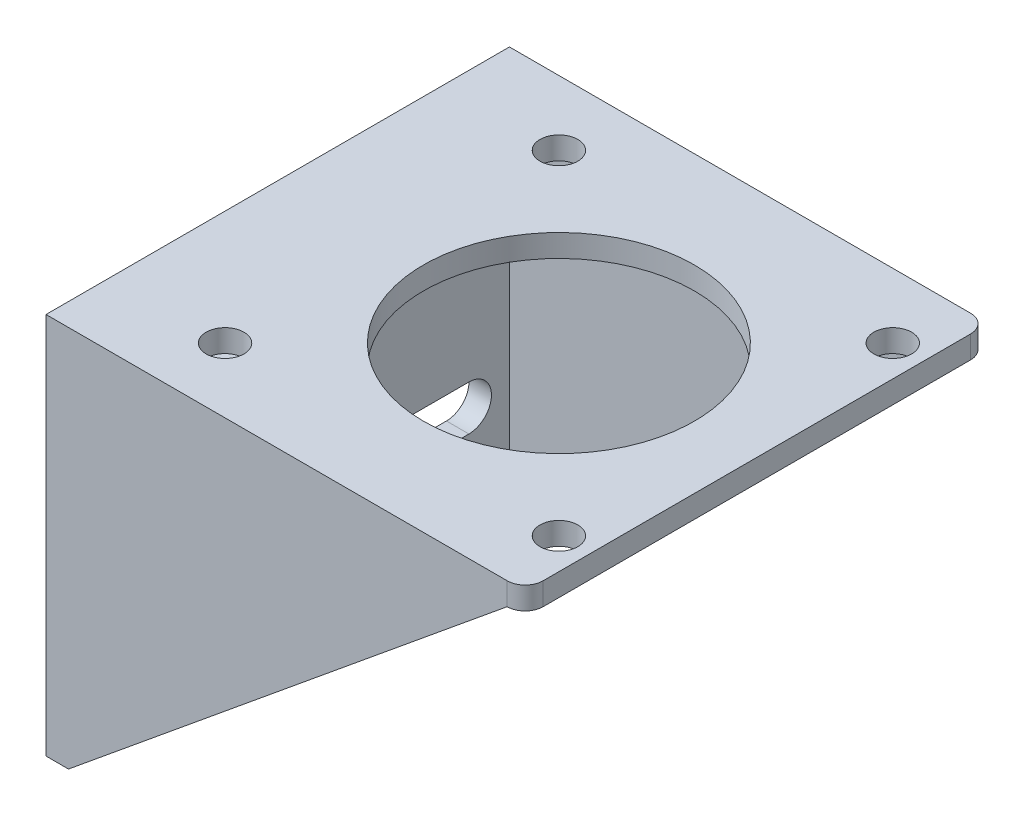
ISO-10303-21;
HEADER;
FILE_DESCRIPTION(('STEP AP214'),'2;1');
FILE_NAME('part.step','',(''),(''),'','','');
FILE_SCHEMA(('AUTOMOTIVE_DESIGN { 1 0 10303 214 1 1 1 1 }'));
ENDSEC;
DATA;
#1=APPLICATION_CONTEXT('core data for automotive mechanical design processes');
#2=APPLICATION_PROTOCOL_DEFINITION('international standard','automotive_design',2000,#1);
#3=PRODUCT_CONTEXT('',#1,'mechanical');
#4=PRODUCT('Part','Part','',(#3));
#5=PRODUCT_RELATED_PRODUCT_CATEGORY('part','',(#4));
#6=PRODUCT_DEFINITION_FORMATION('','',#4);
#7=PRODUCT_DEFINITION_CONTEXT('part definition',#1,'design');
#8=PRODUCT_DEFINITION('design','',#6,#7);
#9=PRODUCT_DEFINITION_SHAPE('','',#8);
#10=(LENGTH_UNIT() NAMED_UNIT(*) SI_UNIT(.MILLI.,.METRE.));
#11=(NAMED_UNIT(*) PLANE_ANGLE_UNIT() SI_UNIT($,.RADIAN.));
#12=(NAMED_UNIT(*) SI_UNIT($,.STERADIAN.) SOLID_ANGLE_UNIT());
#13=UNCERTAINTY_MEASURE_WITH_UNIT(LENGTH_MEASURE(1.E-05),#10,'distance_accuracy_value','');
#14=(GEOMETRIC_REPRESENTATION_CONTEXT(3) GLOBAL_UNCERTAINTY_ASSIGNED_CONTEXT((#13)) GLOBAL_UNIT_ASSIGNED_CONTEXT((#10,
#11,#12)) REPRESENTATION_CONTEXT('',''));
#15=CARTESIAN_POINT('',(0.,0.,0.));
#16=DIRECTION('',(0.,0.,1.));
#17=DIRECTION('',(1.,0.,0.));
#18=AXIS2_PLACEMENT_3D('',#15,#16,#17);
#19=CARTESIAN_POINT('',(-36.5125,0.,0.));
#20=DIRECTION('',(-1.,0.,0.));
#21=DIRECTION('',(0.,0.,1.));
#22=AXIS2_PLACEMENT_3D('',#19,#20,#21);
#23=PLANE('',#22);
#24=DIRECTION('',(0.,0.,1.));
#25=VECTOR('',#24,1.);
#26=CARTESIAN_POINT('',(-36.5125,-31.75,0.));
#27=LINE('',#26,#25);
#28=CARTESIAN_POINT('',(-36.5125,-31.75,2.2225));
#29=VERTEX_POINT('',#28);
#30=CARTESIAN_POINT('',(-36.5125,-31.75,12.3825));
#31=VERTEX_POINT('',#30);
#32=EDGE_CURVE('E300',#29,#31,#27,.T.);
#33=ORIENTED_EDGE('',*,*,#32,.F.);
#34=CARTESIAN_POINT('',(-36.5125,-34.925,2.2225));
#35=DIRECTION('',(1.,0.,0.));
#36=DIRECTION('',(0.,0.,-1.));
#37=AXIS2_PLACEMENT_3D('',#34,#35,#36);
#38=CIRCLE('',#37,3.175);
#39=CARTESIAN_POINT('',(-36.5125,-38.1,2.2225));
#40=VERTEX_POINT('',#39);
#41=EDGE_CURVE('E54',#40,#29,#38,.T.);
#42=ORIENTED_EDGE('',*,*,#41,.F.);
#43=DIRECTION('',(0.,0.,1.));
#44=VECTOR('',#43,1.);
#45=CARTESIAN_POINT('',(-36.5125,-38.1,0.));
#46=LINE('',#45,#44);
#47=CARTESIAN_POINT('',(-36.5125,-38.1,12.3825));
#48=VERTEX_POINT('',#47);
#49=EDGE_CURVE('E290',#40,#48,#46,.T.);
#50=ORIENTED_EDGE('',*,*,#49,.T.);
#51=CARTESIAN_POINT('',(-36.5125,-34.925,12.3825));
#52=DIRECTION('',(1.,0.,0.));
#53=DIRECTION('',(0.,0.,-1.));
#54=AXIS2_PLACEMENT_3D('',#51,#52,#53);
#55=CIRCLE('',#54,3.175);
#56=EDGE_CURVE('E303',#31,#48,#55,.T.);
#57=ORIENTED_EDGE('',*,*,#56,.F.);
#58=EDGE_LOOP('',(#33,#42,#50,#57));
#59=FACE_BOUND('',#58,.T.);
#60=DIRECTION('',(0.,0.,1.));
#61=VECTOR('',#60,1.);
#62=CARTESIAN_POINT('',(-36.5125,-31.75,0.));
#63=LINE('',#62,#61);
#64=CARTESIAN_POINT('',(-36.5125,-31.75,-23.8125));
#65=VERTEX_POINT('',#64);
#66=CARTESIAN_POINT('',(-36.5125,-31.75,-13.6525));
#67=VERTEX_POINT('',#66);
#68=EDGE_CURVE('E271',#65,#67,#63,.T.);
#69=ORIENTED_EDGE('',*,*,#68,.F.);
#70=CARTESIAN_POINT('',(-36.5125,-34.925,-23.8125));
#71=DIRECTION('',(1.,0.,0.));
#72=DIRECTION('',(0.,0.,-1.));
#73=AXIS2_PLACEMENT_3D('',#70,#71,#72);
#74=CIRCLE('',#73,3.175);
#75=CARTESIAN_POINT('',(-36.5125,-38.1,-23.8125));
#76=VERTEX_POINT('',#75);
#77=EDGE_CURVE('E62',#76,#65,#74,.T.);
#78=ORIENTED_EDGE('',*,*,#77,.F.);
#79=DIRECTION('',(0.,0.,1.));
#80=VECTOR('',#79,1.);
#81=CARTESIAN_POINT('',(-36.5125,-38.1,0.));
#82=LINE('',#81,#80);
#83=CARTESIAN_POINT('',(-36.5125,-38.1,-13.6525));
#84=VERTEX_POINT('',#83);
#85=EDGE_CURVE('E261',#76,#84,#82,.T.);
#86=ORIENTED_EDGE('',*,*,#85,.T.);
#87=CARTESIAN_POINT('',(-36.5125,-34.925,-13.6525));
#88=DIRECTION('',(1.,0.,0.));
#89=DIRECTION('',(0.,0.,-1.));
#90=AXIS2_PLACEMENT_3D('',#87,#88,#89);
#91=CIRCLE('',#90,3.175);
#92=EDGE_CURVE('E275',#67,#84,#91,.T.);
#93=ORIENTED_EDGE('',*,*,#92,.F.);
#94=EDGE_LOOP('',(#69,#78,#86,#93));
#95=FACE_BOUND('',#94,.T.);
#96=CARTESIAN_POINT('',(-36.5125,-9.525,-13.6525));
#97=DIRECTION('',(1.,0.,0.));
#98=DIRECTION('',(0.,0.,-1.));
#99=AXIS2_PLACEMENT_3D('',#96,#97,#98);
#100=CIRCLE('',#99,3.175);
#101=CARTESIAN_POINT('',(-36.5125,-6.35,-13.6525));
#102=VERTEX_POINT('',#101);
#103=CARTESIAN_POINT('',(-36.5125,-12.7,-13.6525));
#104=VERTEX_POINT('',#103);
#105=EDGE_CURVE('E246',#102,#104,#100,.T.);
#106=ORIENTED_EDGE('',*,*,#105,.F.);
#107=DIRECTION('',(0.,0.,1.));
#108=VECTOR('',#107,1.);
#109=CARTESIAN_POINT('',(-36.5125,-6.35,0.));
#110=LINE('',#109,#108);
#111=CARTESIAN_POINT('',(-36.5125,-6.35,-23.8125));
#112=VERTEX_POINT('',#111);
#113=EDGE_CURVE('E219',#112,#102,#110,.T.);
#114=ORIENTED_EDGE('',*,*,#113,.F.);
#115=CARTESIAN_POINT('',(-36.5125,-9.525,-23.8125));
#116=DIRECTION('',(1.,0.,0.));
#117=DIRECTION('',(0.,0.,-1.));
#118=AXIS2_PLACEMENT_3D('',#115,#116,#117);
#119=CIRCLE('',#118,3.175);
#120=CARTESIAN_POINT('',(-36.5125,-12.7,-23.8125));
#121=VERTEX_POINT('',#120);
#122=EDGE_CURVE('E237',#121,#112,#119,.T.);
#123=ORIENTED_EDGE('',*,*,#122,.F.);
#124=DIRECTION('',(0.,0.,1.));
#125=VECTOR('',#124,1.);
#126=CARTESIAN_POINT('',(-36.5125,-12.7,0.));
#127=LINE('',#126,#125);
#128=EDGE_CURVE('E240',#121,#104,#127,.T.);
#129=ORIENTED_EDGE('',*,*,#128,.T.);
#130=EDGE_LOOP('',(#106,#114,#123,#129));
#131=FACE_BOUND('',#130,.T.);
#132=DIRECTION('',(0.,1.,0.));
#133=VECTOR('',#132,1.);
#134=CARTESIAN_POINT('',(-36.5125,0.,-29.5275));
#135=LINE('',#134,#133);
#136=CARTESIAN_POINT('',(-36.5125,-50.8,-29.5275));
#137=VERTEX_POINT('',#136);
#138=CARTESIAN_POINT('',(-36.5125,0.,-29.5275));
#139=VERTEX_POINT('',#138);
#140=EDGE_CURVE('E349',#137,#139,#135,.T.);
#141=ORIENTED_EDGE('',*,*,#140,.T.);
#142=DIRECTION('',(0.,0.,-1.));
#143=VECTOR('',#142,1.);
#144=CARTESIAN_POINT('',(-36.5125,0.,-32.7025));
#145=LINE('',#144,#143);
#146=CARTESIAN_POINT('',(-36.5125,0.,29.5275));
#147=VERTEX_POINT('',#146);
#148=EDGE_CURVE('E376',#147,#139,#145,.T.);
#149=ORIENTED_EDGE('',*,*,#148,.F.);
#150=DIRECTION('',(0.,-1.,0.));
#151=VECTOR('',#150,1.);
#152=CARTESIAN_POINT('',(-36.5125,0.,29.5275));
#153=LINE('',#152,#151);
#154=CARTESIAN_POINT('',(-36.5125,-50.8,29.5275));
#155=VERTEX_POINT('',#154);
#156=EDGE_CURVE('E360',#147,#155,#153,.T.);
#157=ORIENTED_EDGE('',*,*,#156,.T.);
#158=DIRECTION('',(0.,0.,1.));
#159=VECTOR('',#158,1.);
#160=CARTESIAN_POINT('',(-36.5125,-50.8,32.7025));
#161=LINE('',#160,#159);
#162=EDGE_CURVE('E379',#137,#155,#161,.T.);
#163=ORIENTED_EDGE('',*,*,#162,.F.);
#164=EDGE_LOOP('',(#141,#149,#157,#163));
#165=FACE_BOUND('',#164,.T.);
#166=DIRECTION('',(0.,0.,1.));
#167=VECTOR('',#166,1.);
#168=CARTESIAN_POINT('',(-36.5125,-12.7,0.));
#169=LINE('',#168,#167);
#170=CARTESIAN_POINT('',(-36.5125,-12.7,2.2225));
#171=VERTEX_POINT('',#170);
#172=CARTESIAN_POINT('',(-36.5125,-12.7,12.3825));
#173=VERTEX_POINT('',#172);
#174=EDGE_CURVE('E253',#171,#173,#169,.T.);
#175=ORIENTED_EDGE('',*,*,#174,.T.);
#176=CARTESIAN_POINT('',(-36.5125,-9.525,12.3825));
#177=DIRECTION('',(1.,0.,0.));
#178=DIRECTION('',(0.,0.,-1.));
#179=AXIS2_PLACEMENT_3D('',#176,#177,#178);
#180=CIRCLE('',#179,3.175);
#181=CARTESIAN_POINT('',(-36.5125,-6.35,12.3825));
#182=VERTEX_POINT('',#181);
#183=EDGE_CURVE('E317',#182,#173,#180,.T.);
#184=ORIENTED_EDGE('',*,*,#183,.F.);
#185=DIRECTION('',(0.,0.,1.));
#186=VECTOR('',#185,1.);
#187=CARTESIAN_POINT('',(-36.5125,-6.35,0.));
#188=LINE('',#187,#186);
#189=CARTESIAN_POINT('',(-36.5125,-6.35,2.2225));
#190=VERTEX_POINT('',#189);
#191=EDGE_CURVE('E332',#190,#182,#188,.T.);
#192=ORIENTED_EDGE('',*,*,#191,.F.);
#193=CARTESIAN_POINT('',(-36.5125,-9.525,2.2225));
#194=DIRECTION('',(1.,0.,0.));
#195=DIRECTION('',(0.,0.,-1.));
#196=AXIS2_PLACEMENT_3D('',#193,#194,#195);
#197=CIRCLE('',#196,3.175);
#198=EDGE_CURVE('E329',#171,#190,#197,.T.);
#199=ORIENTED_EDGE('',*,*,#198,.F.);
#200=EDGE_LOOP('',(#175,#184,#192,#199));
#201=FACE_BOUND('',#200,.T.);
#202=ADVANCED_FACE('F39',(#59,#95,#131,#165,#201),#23,.F.);
#203=CARTESIAN_POINT('',(-39.6875,3.175,32.7025));
#204=DIRECTION('',(1.,0.,0.));
#205=DIRECTION('',(0.,0.,-1.));
#206=AXIS2_PLACEMENT_3D('',#203,#204,#205);
#207=PLANE('',#206);
#208=DIRECTION('',(0.,0.,1.));
#209=VECTOR('',#208,1.);
#210=CARTESIAN_POINT('',(-39.6875,-38.1,0.));
#211=LINE('',#210,#209);
#212=CARTESIAN_POINT('',(-39.6875,-38.1,2.2225));
#213=VERTEX_POINT('',#212);
#214=CARTESIAN_POINT('',(-39.6875,-38.1,12.3825));
#215=VERTEX_POINT('',#214);
#216=EDGE_CURVE('E296',#213,#215,#211,.T.);
#217=ORIENTED_EDGE('',*,*,#216,.F.);
#218=CARTESIAN_POINT('',(-39.6875,-34.925,2.2225));
#219=DIRECTION('',(1.,0.,0.));
#220=DIRECTION('',(0.,0.,-1.));
#221=AXIS2_PLACEMENT_3D('',#218,#219,#220);
#222=CIRCLE('',#221,3.175);
#223=CARTESIAN_POINT('',(-39.6875,-31.75,2.2225));
#224=VERTEX_POINT('',#223);
#225=EDGE_CURVE('E286',#213,#224,#222,.T.);
#226=ORIENTED_EDGE('',*,*,#225,.T.);
#227=DIRECTION('',(0.,0.,1.));
#228=VECTOR('',#227,1.);
#229=CARTESIAN_POINT('',(-39.6875,-31.75,0.));
#230=LINE('',#229,#228);
#231=CARTESIAN_POINT('',(-39.6875,-31.75,12.3825));
#232=VERTEX_POINT('',#231);
#233=EDGE_CURVE('E289',#224,#232,#230,.T.);
#234=ORIENTED_EDGE('',*,*,#233,.T.);
#235=CARTESIAN_POINT('',(-39.6875,-34.925,12.3825));
#236=DIRECTION('',(1.,0.,0.));
#237=DIRECTION('',(0.,0.,-1.));
#238=AXIS2_PLACEMENT_3D('',#235,#236,#237);
#239=CIRCLE('',#238,3.175);
#240=EDGE_CURVE('E293',#232,#215,#239,.T.);
#241=ORIENTED_EDGE('',*,*,#240,.T.);
#242=EDGE_LOOP('',(#217,#226,#234,#241));
#243=FACE_BOUND('',#242,.T.);
#244=DIRECTION('',(0.,0.,1.));
#245=VECTOR('',#244,1.);
#246=CARTESIAN_POINT('',(-39.6875,-38.1,0.));
#247=LINE('',#246,#245);
#248=CARTESIAN_POINT('',(-39.6875,-38.1,-23.8125));
#249=VERTEX_POINT('',#248);
#250=CARTESIAN_POINT('',(-39.6875,-38.1,-13.6525));
#251=VERTEX_POINT('',#250);
#252=EDGE_CURVE('E267',#249,#251,#247,.T.);
#253=ORIENTED_EDGE('',*,*,#252,.F.);
#254=CARTESIAN_POINT('',(-39.6875,-34.925,-23.8125));
#255=DIRECTION('',(1.,0.,0.));
#256=DIRECTION('',(0.,0.,-1.));
#257=AXIS2_PLACEMENT_3D('',#254,#255,#256);
#258=CIRCLE('',#257,3.175);
#259=CARTESIAN_POINT('',(-39.6875,-31.75,-23.8125));
#260=VERTEX_POINT('',#259);
#261=EDGE_CURVE('E257',#249,#260,#258,.T.);
#262=ORIENTED_EDGE('',*,*,#261,.T.);
#263=DIRECTION('',(0.,0.,1.));
#264=VECTOR('',#263,1.);
#265=CARTESIAN_POINT('',(-39.6875,-31.75,0.));
#266=LINE('',#265,#264);
#267=CARTESIAN_POINT('',(-39.6875,-31.75,-13.6525));
#268=VERTEX_POINT('',#267);
#269=EDGE_CURVE('E260',#260,#268,#266,.T.);
#270=ORIENTED_EDGE('',*,*,#269,.T.);
#271=CARTESIAN_POINT('',(-39.6875,-34.925,-13.6525));
#272=DIRECTION('',(1.,0.,0.));
#273=DIRECTION('',(0.,0.,-1.));
#274=AXIS2_PLACEMENT_3D('',#271,#272,#273);
#275=CIRCLE('',#274,3.175);
#276=EDGE_CURVE('E264',#268,#251,#275,.T.);
#277=ORIENTED_EDGE('',*,*,#276,.T.);
#278=EDGE_LOOP('',(#253,#262,#270,#277));
#279=FACE_BOUND('',#278,.T.);
#280=CARTESIAN_POINT('',(-39.6875,-9.525,-23.8125));
#281=DIRECTION('',(1.,0.,0.));
#282=DIRECTION('',(0.,0.,-1.));
#283=AXIS2_PLACEMENT_3D('',#280,#281,#282);
#284=CIRCLE('',#283,3.175);
#285=CARTESIAN_POINT('',(-39.6875,-12.7,-23.8125));
#286=VERTEX_POINT('',#285);
#287=CARTESIAN_POINT('',(-39.6875,-6.35,-23.8125));
#288=VERTEX_POINT('',#287);
#289=EDGE_CURVE('E224',#286,#288,#284,.T.);
#290=ORIENTED_EDGE('',*,*,#289,.T.);
#291=DIRECTION('',(0.,0.,1.));
#292=VECTOR('',#291,1.);
#293=CARTESIAN_POINT('',(-39.6875,-6.35,0.));
#294=LINE('',#293,#292);
#295=CARTESIAN_POINT('',(-39.6875,-6.35,-13.6525));
#296=VERTEX_POINT('',#295);
#297=EDGE_CURVE('E216',#288,#296,#294,.T.);
#298=ORIENTED_EDGE('',*,*,#297,.T.);
#299=CARTESIAN_POINT('',(-39.6875,-9.525,-13.6525));
#300=DIRECTION('',(1.,0.,0.));
#301=DIRECTION('',(0.,0.,-1.));
#302=AXIS2_PLACEMENT_3D('',#299,#300,#301);
#303=CIRCLE('',#302,3.175);
#304=CARTESIAN_POINT('',(-39.6875,-12.7,-13.6525));
#305=VERTEX_POINT('',#304);
#306=EDGE_CURVE('E227',#296,#305,#303,.T.);
#307=ORIENTED_EDGE('',*,*,#306,.T.);
#308=DIRECTION('',(0.,0.,1.));
#309=VECTOR('',#308,1.);
#310=CARTESIAN_POINT('',(-39.6875,-12.7,0.));
#311=LINE('',#310,#309);
#312=EDGE_CURVE('E232',#286,#305,#311,.T.);
#313=ORIENTED_EDGE('',*,*,#312,.F.);
#314=EDGE_LOOP('',(#290,#298,#307,#313));
#315=FACE_BOUND('',#314,.T.);
#316=DIRECTION('',(0.,-1.,0.));
#317=VECTOR('',#316,1.);
#318=CARTESIAN_POINT('',(-39.6875,3.175,-32.7025));
#319=LINE('',#318,#317);
#320=CARTESIAN_POINT('',(-39.6875,3.175,-32.7025));
#321=VERTEX_POINT('',#320);
#322=CARTESIAN_POINT('',(-39.6875,-50.8,-32.7025));
#323=VERTEX_POINT('',#322);
#324=EDGE_CURVE('E433',#321,#323,#319,.T.);
#325=ORIENTED_EDGE('',*,*,#324,.T.);
#326=DIRECTION('',(0.,0.,1.));
#327=VECTOR('',#326,1.);
#328=CARTESIAN_POINT('',(-39.6875,-50.8,32.7025));
#329=LINE('',#328,#327);
#330=CARTESIAN_POINT('',(-39.6875,-50.8,32.7025));
#331=VERTEX_POINT('',#330);
#332=EDGE_CURVE('E373',#323,#331,#329,.T.);
#333=ORIENTED_EDGE('',*,*,#332,.T.);
#334=DIRECTION('',(0.,-1.,0.));
#335=VECTOR('',#334,1.);
#336=CARTESIAN_POINT('',(-39.6875,3.175,32.7025));
#337=LINE('',#336,#335);
#338=CARTESIAN_POINT('',(-39.6875,3.175,32.7025));
#339=VERTEX_POINT('',#338);
#340=EDGE_CURVE('E437',#339,#331,#337,.T.);
#341=ORIENTED_EDGE('',*,*,#340,.F.);
#342=DIRECTION('',(0.,0.,1.));
#343=VECTOR('',#342,1.);
#344=CARTESIAN_POINT('',(-39.6875,3.175,32.7025));
#345=LINE('',#344,#343);
#346=EDGE_CURVE('E422',#321,#339,#345,.T.);
#347=ORIENTED_EDGE('',*,*,#346,.F.);
#348=EDGE_LOOP('',(#325,#333,#341,#347));
#349=FACE_BOUND('',#348,.T.);
#350=DIRECTION('',(0.,0.,1.));
#351=VECTOR('',#350,1.);
#352=CARTESIAN_POINT('',(-39.6875,-12.7,0.));
#353=LINE('',#352,#351);
#354=CARTESIAN_POINT('',(-39.6875,-12.7,2.2225));
#355=VERTEX_POINT('',#354);
#356=CARTESIAN_POINT('',(-39.6875,-12.7,12.3825));
#357=VERTEX_POINT('',#356);
#358=EDGE_CURVE('E314',#355,#357,#353,.T.);
#359=ORIENTED_EDGE('',*,*,#358,.F.);
#360=CARTESIAN_POINT('',(-39.6875,-9.525,2.2225));
#361=DIRECTION('',(1.,0.,0.));
#362=DIRECTION('',(0.,0.,-1.));
#363=AXIS2_PLACEMENT_3D('',#360,#361,#362);
#364=CIRCLE('',#363,3.175);
#365=CARTESIAN_POINT('',(-39.6875,-6.35,2.2225));
#366=VERTEX_POINT('',#365);
#367=EDGE_CURVE('E316',#355,#366,#364,.T.);
#368=ORIENTED_EDGE('',*,*,#367,.T.);
#369=DIRECTION('',(0.,0.,1.));
#370=VECTOR('',#369,1.);
#371=CARTESIAN_POINT('',(-39.6875,-6.35,0.));
#372=LINE('',#371,#370);
#373=CARTESIAN_POINT('',(-39.6875,-6.35,12.3825));
#374=VERTEX_POINT('',#373);
#375=EDGE_CURVE('E320',#366,#374,#372,.T.);
#376=ORIENTED_EDGE('',*,*,#375,.T.);
#377=CARTESIAN_POINT('',(-39.6875,-9.525,12.3825));
#378=DIRECTION('',(1.,0.,0.));
#379=DIRECTION('',(0.,0.,-1.));
#380=AXIS2_PLACEMENT_3D('',#377,#378,#379);
#381=CIRCLE('',#380,3.175);
#382=EDGE_CURVE('E323',#374,#357,#381,.T.);
#383=ORIENTED_EDGE('',*,*,#382,.T.);
#384=EDGE_LOOP('',(#359,#368,#376,#383));
#385=FACE_BOUND('',#384,.T.);
#386=ADVANCED_FACE('F234',(#243,#279,#315,#349,#385),#207,.F.);
#387=CARTESIAN_POINT('',(0.,0.,0.));
#388=DIRECTION('',(0.,-1.,0.));
#389=DIRECTION('',(0.,0.,-1.));
#390=AXIS2_PLACEMENT_3D('',#387,#388,#389);
#391=PLANE('',#390);
#392=DIRECTION('',(0.,0.,-1.));
#393=VECTOR('',#392,1.);
#394=CARTESIAN_POINT('',(25.4,0.,-29.5275));
#395=LINE('',#394,#393);
#396=CARTESIAN_POINT('',(25.4,0.,-29.5275));
#397=VERTEX_POINT('',#396);
#398=CARTESIAN_POINT('',(25.4,0.,-32.7025));
#399=VERTEX_POINT('',#398);
#400=EDGE_CURVE('E355',#397,#399,#395,.T.);
#401=ORIENTED_EDGE('',*,*,#400,.T.);
#402=CARTESIAN_POINT('',(25.4,0.,-30.1625));
#403=DIRECTION('',(0.,-1.,0.));
#404=DIRECTION('',(0.,0.,-1.));
#405=AXIS2_PLACEMENT_3D('',#402,#403,#404);
#406=CIRCLE('',#405,2.54);
#407=CARTESIAN_POINT('',(27.94,0.,-30.1625));
#408=VERTEX_POINT('',#407);
#409=EDGE_CURVE('E444',#399,#408,#406,.T.);
#410=ORIENTED_EDGE('',*,*,#409,.T.);
#411=DIRECTION('',(0.,0.,-1.));
#412=VECTOR('',#411,1.);
#413=CARTESIAN_POINT('',(27.94,0.,-32.7025));
#414=LINE('',#413,#412);
#415=CARTESIAN_POINT('',(27.94,0.,30.1625));
#416=VERTEX_POINT('',#415);
#417=EDGE_CURVE('E419',#416,#408,#414,.T.);
#418=ORIENTED_EDGE('',*,*,#417,.F.);
#419=CARTESIAN_POINT('',(25.4,0.,30.1625));
#420=DIRECTION('',(0.,-1.,0.));
#421=DIRECTION('',(0.,0.,-1.));
#422=AXIS2_PLACEMENT_3D('',#419,#420,#421);
#423=CIRCLE('',#422,2.54);
#424=CARTESIAN_POINT('',(25.4,0.,32.7025));
#425=VERTEX_POINT('',#424);
#426=EDGE_CURVE('E446',#416,#425,#423,.T.);
#427=ORIENTED_EDGE('',*,*,#426,.T.);
#428=DIRECTION('',(0.,0.,1.));
#429=VECTOR('',#428,1.);
#430=CARTESIAN_POINT('',(25.4,0.,29.5275));
#431=LINE('',#430,#429);
#432=CARTESIAN_POINT('',(25.4,0.,29.5275));
#433=VERTEX_POINT('',#432);
#434=EDGE_CURVE('E371',#433,#425,#431,.T.);
#435=ORIENTED_EDGE('',*,*,#434,.F.);
#436=DIRECTION('',(-1.,0.,0.));
#437=VECTOR('',#436,1.);
#438=CARTESIAN_POINT('',(25.4,0.,29.5275));
#439=LINE('',#438,#437);
#440=EDGE_CURVE('E365',#433,#147,#439,.T.);
#441=ORIENTED_EDGE('',*,*,#440,.T.);
#442=ORIENTED_EDGE('',*,*,#148,.T.);
#443=DIRECTION('',(1.,0.,0.));
#444=VECTOR('',#443,1.);
#445=CARTESIAN_POINT('',(25.4,0.,-29.5275));
#446=LINE('',#445,#444);
#447=EDGE_CURVE('E352',#139,#397,#446,.T.);
#448=ORIENTED_EDGE('',*,*,#447,.T.);
#449=EDGE_LOOP('',(#401,#410,#418,#427,#435,#441,#442,#448));
#450=FACE_BOUND('',#449,.T.);
#451=CARTESIAN_POINT('',(-23.5585,0.,23.5585));
#452=DIRECTION('',(0.,1.,0.));
#453=DIRECTION('',(0.,0.,1.));
#454=AXIS2_PLACEMENT_3D('',#451,#452,#453);
#455=CIRCLE('',#454,2.667);
#456=CARTESIAN_POINT('',(-23.5585,0.,26.2255));
#457=VERTEX_POINT('',#456);
#458=EDGE_CURVE('E395',#457,#457,#455,.T.);
#459=ORIENTED_EDGE('',*,*,#458,.T.);
#460=EDGE_LOOP('',(#459));
#461=FACE_BOUND('',#460,.T.);
#462=CARTESIAN_POINT('',(-23.5585,0.,-23.5585));
#463=DIRECTION('',(0.,1.,0.));
#464=DIRECTION('',(0.,0.,1.));
#465=AXIS2_PLACEMENT_3D('',#462,#463,#464);
#466=CIRCLE('',#465,2.667);
#467=CARTESIAN_POINT('',(-23.5585,0.,-20.8915));
#468=VERTEX_POINT('',#467);
#469=EDGE_CURVE('E407',#468,#468,#466,.T.);
#470=ORIENTED_EDGE('',*,*,#469,.T.);
#471=EDGE_LOOP('',(#470));
#472=FACE_BOUND('',#471,.T.);
#473=CARTESIAN_POINT('',(0.,0.,0.));
#474=DIRECTION('',(0.,1.,0.));
#475=DIRECTION('',(0.,0.,1.));
#476=AXIS2_PLACEMENT_3D('',#473,#474,#475);
#477=CIRCLE('',#476,19.1135);
#478=CARTESIAN_POINT('',(0.,0.,19.1135));
#479=VERTEX_POINT('',#478);
#480=EDGE_CURVE('E413',#479,#479,#477,.T.);
#481=ORIENTED_EDGE('',*,*,#480,.T.);
#482=EDGE_LOOP('',(#481));
#483=FACE_BOUND('',#482,.T.);
#484=CARTESIAN_POINT('',(23.5585,0.,-23.5585));
#485=DIRECTION('',(0.,1.,0.));
#486=DIRECTION('',(0.,0.,1.));
#487=AXIS2_PLACEMENT_3D('',#484,#485,#486);
#488=CIRCLE('',#487,2.667);
#489=CARTESIAN_POINT('',(23.5585,0.,-20.8915));
#490=VERTEX_POINT('',#489);
#491=EDGE_CURVE('E401',#490,#490,#488,.T.);
#492=ORIENTED_EDGE('',*,*,#491,.T.);
#493=EDGE_LOOP('',(#492));
#494=FACE_BOUND('',#493,.T.);
#495=CARTESIAN_POINT('',(23.5585,0.,23.5585));
#496=DIRECTION('',(0.,1.,0.));
#497=DIRECTION('',(0.,0.,1.));
#498=AXIS2_PLACEMENT_3D('',#495,#496,#497);
#499=CIRCLE('',#498,2.667);
#500=CARTESIAN_POINT('',(23.5585,0.,26.2255));
#501=VERTEX_POINT('',#500);
#502=EDGE_CURVE('E389',#501,#501,#499,.T.);
#503=ORIENTED_EDGE('',*,*,#502,.T.);
#504=EDGE_LOOP('',(#503));
#505=FACE_BOUND('',#504,.T.);
#506=ADVANCED_FACE('F468',(#450,#461,#472,#483,#494,#505),#391,.T.);
#507=CARTESIAN_POINT('',(0.,3.175,0.));
#508=DIRECTION('',(0.,-1.,0.));
#509=DIRECTION('',(0.,0.,-1.));
#510=AXIS2_PLACEMENT_3D('',#507,#508,#509);
#511=PLANE('',#510);
#512=DIRECTION('',(1.,0.,0.));
#513=VECTOR('',#512,1.);
#514=CARTESIAN_POINT('',(27.94,3.175,32.7025));
#515=LINE('',#514,#513);
#516=CARTESIAN_POINT('',(25.4,3.175,32.7025));
#517=VERTEX_POINT('',#516);
#518=EDGE_CURVE('E425',#339,#517,#515,.T.);
#519=ORIENTED_EDGE('',*,*,#518,.T.);
#520=CARTESIAN_POINT('',(25.4,3.175,30.1625));
#521=DIRECTION('',(0.,-1.,0.));
#522=DIRECTION('',(0.,0.,-1.));
#523=AXIS2_PLACEMENT_3D('',#520,#521,#522);
#524=CIRCLE('',#523,2.54);
#525=CARTESIAN_POINT('',(27.94,3.175,30.1625));
#526=VERTEX_POINT('',#525);
#527=EDGE_CURVE('E47',#517,#526,#524,.F.);
#528=ORIENTED_EDGE('',*,*,#527,.T.);
#529=DIRECTION('',(0.,0.,-1.));
#530=VECTOR('',#529,1.);
#531=CARTESIAN_POINT('',(27.94,3.175,-32.7025));
#532=LINE('',#531,#530);
#533=CARTESIAN_POINT('',(27.94,3.175,-30.1625));
#534=VERTEX_POINT('',#533);
#535=EDGE_CURVE('E428',#526,#534,#532,.T.);
#536=ORIENTED_EDGE('',*,*,#535,.T.);
#537=CARTESIAN_POINT('',(25.4,3.175,-30.1625));
#538=DIRECTION('',(0.,-1.,0.));
#539=DIRECTION('',(0.,0.,-1.));
#540=AXIS2_PLACEMENT_3D('',#537,#538,#539);
#541=CIRCLE('',#540,2.54);
#542=CARTESIAN_POINT('',(25.4,3.175,-32.7025));
#543=VERTEX_POINT('',#542);
#544=EDGE_CURVE('E451',#534,#543,#541,.F.);
#545=ORIENTED_EDGE('',*,*,#544,.T.);
#546=DIRECTION('',(-1.,0.,0.));
#547=VECTOR('',#546,1.);
#548=CARTESIAN_POINT('',(-39.6875,3.175,-32.7025));
#549=LINE('',#548,#547);
#550=EDGE_CURVE('E431',#543,#321,#549,.T.);
#551=ORIENTED_EDGE('',*,*,#550,.T.);
#552=ORIENTED_EDGE('',*,*,#346,.T.);
#553=EDGE_LOOP('',(#519,#528,#536,#545,#551,#552));
#554=FACE_BOUND('',#553,.T.);
#555=CARTESIAN_POINT('',(0.,3.175,0.));
#556=DIRECTION('',(0.,1.,0.));
#557=DIRECTION('',(0.,0.,1.));
#558=AXIS2_PLACEMENT_3D('',#555,#556,#557);
#559=CIRCLE('',#558,19.1135);
#560=CARTESIAN_POINT('',(0.,3.175,19.1135));
#561=VERTEX_POINT('',#560);
#562=EDGE_CURVE('E416',#561,#561,#559,.T.);
#563=ORIENTED_EDGE('',*,*,#562,.F.);
#564=EDGE_LOOP('',(#563));
#565=FACE_BOUND('',#564,.T.);
#566=CARTESIAN_POINT('',(-23.5585,3.175,-23.5585));
#567=DIRECTION('',(0.,1.,0.));
#568=DIRECTION('',(0.,0.,1.));
#569=AXIS2_PLACEMENT_3D('',#566,#567,#568);
#570=CIRCLE('',#569,2.667);
#571=CARTESIAN_POINT('',(-23.5585,3.175,-20.8915));
#572=VERTEX_POINT('',#571);
#573=EDGE_CURVE('E410',#572,#572,#570,.T.);
#574=ORIENTED_EDGE('',*,*,#573,.F.);
#575=EDGE_LOOP('',(#574));
#576=FACE_BOUND('',#575,.T.);
#577=CARTESIAN_POINT('',(23.5585,3.175,-23.5585));
#578=DIRECTION('',(0.,1.,0.));
#579=DIRECTION('',(0.,0.,1.));
#580=AXIS2_PLACEMENT_3D('',#577,#578,#579);
#581=CIRCLE('',#580,2.667);
#582=CARTESIAN_POINT('',(23.5585,3.175,-20.8915));
#583=VERTEX_POINT('',#582);
#584=EDGE_CURVE('E404',#583,#583,#581,.T.);
#585=ORIENTED_EDGE('',*,*,#584,.F.);
#586=EDGE_LOOP('',(#585));
#587=FACE_BOUND('',#586,.T.);
#588=CARTESIAN_POINT('',(-23.5585,3.175,23.5585));
#589=DIRECTION('',(0.,1.,0.));
#590=DIRECTION('',(0.,0.,1.));
#591=AXIS2_PLACEMENT_3D('',#588,#589,#590);
#592=CIRCLE('',#591,2.667);
#593=CARTESIAN_POINT('',(-23.5585,3.175,26.2255));
#594=VERTEX_POINT('',#593);
#595=EDGE_CURVE('E398',#594,#594,#592,.T.);
#596=ORIENTED_EDGE('',*,*,#595,.F.);
#597=EDGE_LOOP('',(#596));
#598=FACE_BOUND('',#597,.T.);
#599=CARTESIAN_POINT('',(23.5585,3.175,23.5585));
#600=DIRECTION('',(0.,1.,0.));
#601=DIRECTION('',(0.,0.,1.));
#602=AXIS2_PLACEMENT_3D('',#599,#600,#601);
#603=CIRCLE('',#602,2.667);
#604=CARTESIAN_POINT('',(23.5585,3.175,26.2255));
#605=VERTEX_POINT('',#604);
#606=EDGE_CURVE('E392',#605,#605,#603,.T.);
#607=ORIENTED_EDGE('',*,*,#606,.F.);
#608=EDGE_LOOP('',(#607));
#609=FACE_BOUND('',#608,.T.);
#610=ADVANCED_FACE('F455',(#554,#565,#576,#587,#598,#609),#511,.F.);
#611=CARTESIAN_POINT('',(27.94,3.175,32.7025));
#612=DIRECTION('',(0.,0.,-1.));
#613=DIRECTION('',(-1.,0.,0.));
#614=AXIS2_PLACEMENT_3D('',#611,#612,#613);
#615=PLANE('',#614);
#616=DIRECTION('',(0.77307337048259,0.634316611678023,0.));
#617=VECTOR('',#616,1.);
#618=CARTESIAN_POINT('',(-36.5125,-50.8,32.7025));
#619=LINE('',#618,#617);
#620=CARTESIAN_POINT('',(-36.5125,-50.8,32.7025));
#621=VERTEX_POINT('',#620);
#622=EDGE_CURVE('E359',#621,#425,#619,.T.);
#623=ORIENTED_EDGE('',*,*,#622,.T.);
#624=DIRECTION('',(0.,-1.,0.));
#625=VECTOR('',#624,1.);
#626=CARTESIAN_POINT('',(25.4,3.175,32.7025));
#627=LINE('',#626,#625);
#628=EDGE_CURVE('E449',#425,#517,#627,.F.);
#629=ORIENTED_EDGE('',*,*,#628,.T.);
#630=ORIENTED_EDGE('',*,*,#518,.F.);
#631=ORIENTED_EDGE('',*,*,#340,.T.);
#632=DIRECTION('',(-1.,0.,0.));
#633=VECTOR('',#632,1.);
#634=CARTESIAN_POINT('',(-36.5125,-50.8,32.7025));
#635=LINE('',#634,#633);
#636=EDGE_CURVE('E386',#621,#331,#635,.T.);
#637=ORIENTED_EDGE('',*,*,#636,.F.);
#638=EDGE_LOOP('',(#623,#629,#630,#631,#637));
#639=FACE_BOUND('',#638,.T.);
#640=ADVANCED_FACE('F484',(#639),#615,.F.);
#641=CARTESIAN_POINT('',(27.94,3.175,-32.7025));
#642=DIRECTION('',(-1.,0.,0.));
#643=DIRECTION('',(0.,0.,1.));
#644=AXIS2_PLACEMENT_3D('',#641,#642,#643);
#645=PLANE('',#644);
#646=ORIENTED_EDGE('',*,*,#535,.F.);
#647=DIRECTION('',(0.,-1.,0.));
#648=VECTOR('',#647,1.);
#649=CARTESIAN_POINT('',(27.94,3.175,30.1625));
#650=LINE('',#649,#648);
#651=EDGE_CURVE('E441',#526,#416,#650,.T.);
#652=ORIENTED_EDGE('',*,*,#651,.T.);
#653=ORIENTED_EDGE('',*,*,#417,.T.);
#654=DIRECTION('',(0.,-1.,0.));
#655=VECTOR('',#654,1.);
#656=CARTESIAN_POINT('',(27.94,3.175,-30.1625));
#657=LINE('',#656,#655);
#658=EDGE_CURVE('E439',#408,#534,#657,.F.);
#659=ORIENTED_EDGE('',*,*,#658,.T.);
#660=EDGE_LOOP('',(#646,#652,#653,#659));
#661=FACE_BOUND('',#660,.T.);
#662=ADVANCED_FACE('F462',(#661),#645,.F.);
#663=CARTESIAN_POINT('',(-39.6875,3.175,-32.7025));
#664=DIRECTION('',(0.,0.,1.));
#665=DIRECTION('',(1.,0.,0.));
#666=AXIS2_PLACEMENT_3D('',#663,#664,#665);
#667=PLANE('',#666);
#668=ORIENTED_EDGE('',*,*,#550,.F.);
#669=DIRECTION('',(0.,-1.,0.));
#670=VECTOR('',#669,1.);
#671=CARTESIAN_POINT('',(25.4,3.175,-32.7025));
#672=LINE('',#671,#670);
#673=EDGE_CURVE('E11',#543,#399,#672,.T.);
#674=ORIENTED_EDGE('',*,*,#673,.T.);
#675=DIRECTION('',(-0.77307337048259,-0.634316611678023,0.));
#676=VECTOR('',#675,1.);
#677=CARTESIAN_POINT('',(-36.5125,-50.8,-32.7025));
#678=LINE('',#677,#676);
#679=CARTESIAN_POINT('',(-36.5125,-50.8,-32.7025));
#680=VERTEX_POINT('',#679);
#681=EDGE_CURVE('E339',#399,#680,#678,.T.);
#682=ORIENTED_EDGE('',*,*,#681,.T.);
#683=DIRECTION('',(-1.,0.,0.));
#684=VECTOR('',#683,1.);
#685=CARTESIAN_POINT('',(-36.5125,-50.8,-32.7025));
#686=LINE('',#685,#684);
#687=EDGE_CURVE('E383',#680,#323,#686,.T.);
#688=ORIENTED_EDGE('',*,*,#687,.T.);
#689=ORIENTED_EDGE('',*,*,#324,.F.);
#690=EDGE_LOOP('',(#668,#674,#682,#688,#689));
#691=FACE_BOUND('',#690,.T.);
#692=ADVANCED_FACE('F476',(#691),#667,.F.);
#693=CARTESIAN_POINT('',(0.,3.175,0.));
#694=DIRECTION('',(0.,-1.,0.));
#695=DIRECTION('',(0.,0.,-1.));
#696=AXIS2_PLACEMENT_3D('',#693,#694,#695);
#697=CYLINDRICAL_SURFACE('',#696,19.1135);
#698=ORIENTED_EDGE('',*,*,#562,.T.);
#699=EDGE_LOOP('',(#698));
#700=FACE_BOUND('',#699,.T.);
#701=ORIENTED_EDGE('',*,*,#480,.F.);
#702=EDGE_LOOP('',(#701));
#703=FACE_BOUND('',#702,.T.);
#704=ADVANCED_FACE('F542',(#700,#703),#697,.F.);
#705=CARTESIAN_POINT('',(-23.5585,3.175,-23.5585));
#706=DIRECTION('',(0.,-1.,0.));
#707=DIRECTION('',(0.,0.,-1.));
#708=AXIS2_PLACEMENT_3D('',#705,#706,#707);
#709=CYLINDRICAL_SURFACE('',#708,2.667);
#710=ORIENTED_EDGE('',*,*,#573,.T.);
#711=EDGE_LOOP('',(#710));
#712=FACE_BOUND('',#711,.T.);
#713=ORIENTED_EDGE('',*,*,#469,.F.);
#714=EDGE_LOOP('',(#713));
#715=FACE_BOUND('',#714,.T.);
#716=ADVANCED_FACE('F538',(#712,#715),#709,.F.);
#717=CARTESIAN_POINT('',(23.5585,3.175,-23.5585));
#718=DIRECTION('',(0.,-1.,0.));
#719=DIRECTION('',(0.,0.,-1.));
#720=AXIS2_PLACEMENT_3D('',#717,#718,#719);
#721=CYLINDRICAL_SURFACE('',#720,2.667);
#722=ORIENTED_EDGE('',*,*,#584,.T.);
#723=EDGE_LOOP('',(#722));
#724=FACE_BOUND('',#723,.T.);
#725=ORIENTED_EDGE('',*,*,#491,.F.);
#726=EDGE_LOOP('',(#725));
#727=FACE_BOUND('',#726,.T.);
#728=ADVANCED_FACE('F534',(#724,#727),#721,.F.);
#729=CARTESIAN_POINT('',(-23.5585,3.175,23.5585));
#730=DIRECTION('',(0.,-1.,0.));
#731=DIRECTION('',(0.,0.,-1.));
#732=AXIS2_PLACEMENT_3D('',#729,#730,#731);
#733=CYLINDRICAL_SURFACE('',#732,2.667);
#734=ORIENTED_EDGE('',*,*,#595,.T.);
#735=EDGE_LOOP('',(#734));
#736=FACE_BOUND('',#735,.T.);
#737=ORIENTED_EDGE('',*,*,#458,.F.);
#738=EDGE_LOOP('',(#737));
#739=FACE_BOUND('',#738,.T.);
#740=ADVANCED_FACE('F530',(#736,#739),#733,.F.);
#741=CARTESIAN_POINT('',(23.5585,3.175,23.5585));
#742=DIRECTION('',(0.,-1.,0.));
#743=DIRECTION('',(0.,0.,-1.));
#744=AXIS2_PLACEMENT_3D('',#741,#742,#743);
#745=CYLINDRICAL_SURFACE('',#744,2.667);
#746=ORIENTED_EDGE('',*,*,#606,.T.);
#747=EDGE_LOOP('',(#746));
#748=FACE_BOUND('',#747,.T.);
#749=ORIENTED_EDGE('',*,*,#502,.F.);
#750=EDGE_LOOP('',(#749));
#751=FACE_BOUND('',#750,.T.);
#752=ADVANCED_FACE('F527',(#748,#751),#745,.F.);
#753=CARTESIAN_POINT('',(25.4,3.175,30.1625));
#754=DIRECTION('',(0.,-1.,0.));
#755=DIRECTION('',(0.,0.,-1.));
#756=AXIS2_PLACEMENT_3D('',#753,#754,#755);
#757=CYLINDRICAL_SURFACE('',#756,2.54);
#758=ORIENTED_EDGE('',*,*,#527,.F.);
#759=ORIENTED_EDGE('',*,*,#628,.F.);
#760=ORIENTED_EDGE('',*,*,#426,.F.);
#761=ORIENTED_EDGE('',*,*,#651,.F.);
#762=EDGE_LOOP('',(#758,#759,#760,#761));
#763=FACE_BOUND('',#762,.T.);
#764=ADVANCED_FACE('F465',(#763),#757,.T.);
#765=CARTESIAN_POINT('',(25.4,3.175,-30.1625));
#766=DIRECTION('',(0.,-1.,0.));
#767=DIRECTION('',(0.,0.,-1.));
#768=AXIS2_PLACEMENT_3D('',#765,#766,#767);
#769=CYLINDRICAL_SURFACE('',#768,2.54);
#770=ORIENTED_EDGE('',*,*,#544,.F.);
#771=ORIENTED_EDGE('',*,*,#658,.F.);
#772=ORIENTED_EDGE('',*,*,#409,.F.);
#773=ORIENTED_EDGE('',*,*,#673,.F.);
#774=EDGE_LOOP('',(#770,#771,#772,#773));
#775=FACE_BOUND('',#774,.T.);
#776=ADVANCED_FACE('F41',(#775),#769,.T.);
#777=CARTESIAN_POINT('',(-36.5125,-50.8,32.7025));
#778=DIRECTION('',(0.,-1.,0.));
#779=DIRECTION('',(0.,0.,-1.));
#780=AXIS2_PLACEMENT_3D('',#777,#778,#779);
#781=PLANE('',#780);
#782=ORIENTED_EDGE('',*,*,#332,.F.);
#783=ORIENTED_EDGE('',*,*,#687,.F.);
#784=EDGE_CURVE('E380',#680,#137,#161,.T.);
#785=ORIENTED_EDGE('',*,*,#784,.T.);
#786=ORIENTED_EDGE('',*,*,#162,.T.);
#787=DIRECTION('',(0.,0.,1.));
#788=VECTOR('',#787,1.);
#789=CARTESIAN_POINT('',(-36.5125,-50.8,29.5275));
#790=LINE('',#789,#788);
#791=EDGE_CURVE('E368',#155,#621,#790,.T.);
#792=ORIENTED_EDGE('',*,*,#791,.T.);
#793=ORIENTED_EDGE('',*,*,#636,.T.);
#794=EDGE_LOOP('',(#782,#783,#785,#786,#792,#793));
#795=FACE_BOUND('',#794,.T.);
#796=ADVANCED_FACE('F486',(#795),#781,.T.);
#797=CARTESIAN_POINT('',(-36.5125,-50.8,29.5275));
#798=DIRECTION('',(0.634316611678023,-0.77307337048259,0.));
#799=DIRECTION('',(0.77307337048259,0.634316611678023,0.));
#800=AXIS2_PLACEMENT_3D('',#797,#798,#799);
#801=PLANE('',#800);
#802=ORIENTED_EDGE('',*,*,#622,.F.);
#803=ORIENTED_EDGE('',*,*,#791,.F.);
#804=DIRECTION('',(0.77307337048259,0.634316611678023,0.));
#805=VECTOR('',#804,1.);
#806=CARTESIAN_POINT('',(-36.5125,-50.8,29.5275));
#807=LINE('',#806,#805);
#808=EDGE_CURVE('E363',#155,#433,#807,.T.);
#809=ORIENTED_EDGE('',*,*,#808,.T.);
#810=ORIENTED_EDGE('',*,*,#434,.T.);
#811=EDGE_LOOP('',(#802,#803,#809,#810));
#812=FACE_BOUND('',#811,.T.);
#813=ADVANCED_FACE('F491',(#812),#801,.T.);
#814=CARTESIAN_POINT('',(0.,0.,29.5275));
#815=DIRECTION('',(0.,0.,-1.));
#816=DIRECTION('',(-1.,0.,0.));
#817=AXIS2_PLACEMENT_3D('',#814,#815,#816);
#818=PLANE('',#817);
#819=ORIENTED_EDGE('',*,*,#156,.F.);
#820=ORIENTED_EDGE('',*,*,#440,.F.);
#821=ORIENTED_EDGE('',*,*,#808,.F.);
#822=EDGE_LOOP('',(#819,#820,#821));
#823=FACE_BOUND('',#822,.T.);
#824=ADVANCED_FACE('F494',(#823),#818,.T.);
#825=CARTESIAN_POINT('',(-36.5125,-50.8,-29.5275));
#826=DIRECTION('',(0.634316611678023,-0.77307337048259,0.));
#827=DIRECTION('',(0.77307337048259,0.634316611678023,0.));
#828=AXIS2_PLACEMENT_3D('',#825,#826,#827);
#829=PLANE('',#828);
#830=ORIENTED_EDGE('',*,*,#681,.F.);
#831=ORIENTED_EDGE('',*,*,#400,.F.);
#832=DIRECTION('',(-0.77307337048259,-0.634316611678023,0.));
#833=VECTOR('',#832,1.);
#834=CARTESIAN_POINT('',(-36.5125,-50.8,-29.5275));
#835=LINE('',#834,#833);
#836=EDGE_CURVE('E346',#397,#137,#835,.T.);
#837=ORIENTED_EDGE('',*,*,#836,.T.);
#838=ORIENTED_EDGE('',*,*,#784,.F.);
#839=EDGE_LOOP('',(#830,#831,#837,#838));
#840=FACE_BOUND('',#839,.T.);
#841=ADVANCED_FACE('F503',(#840),#829,.T.);
#842=CARTESIAN_POINT('',(0.,0.,-29.5275));
#843=DIRECTION('',(0.,0.,-1.));
#844=DIRECTION('',(-1.,0.,0.));
#845=AXIS2_PLACEMENT_3D('',#842,#843,#844);
#846=PLANE('',#845);
#847=ORIENTED_EDGE('',*,*,#836,.F.);
#848=ORIENTED_EDGE('',*,*,#447,.F.);
#849=ORIENTED_EDGE('',*,*,#140,.F.);
#850=EDGE_LOOP('',(#847,#848,#849));
#851=FACE_BOUND('',#850,.T.);
#852=ADVANCED_FACE('F500',(#851),#846,.F.);
#853=CARTESIAN_POINT('',(-39.6875,-12.7,0.));
#854=DIRECTION('',(0.,1.,0.));
#855=DIRECTION('',(0.,0.,1.));
#856=AXIS2_PLACEMENT_3D('',#853,#854,#855);
#857=PLANE('',#856);
#858=ORIENTED_EDGE('',*,*,#174,.F.);
#859=DIRECTION('',(1.,0.,0.));
#860=VECTOR('',#859,1.);
#861=CARTESIAN_POINT('',(-39.6875,-12.7,2.2225));
#862=LINE('',#861,#860);
#863=EDGE_CURVE('E326',#355,#171,#862,.T.);
#864=ORIENTED_EDGE('',*,*,#863,.F.);
#865=ORIENTED_EDGE('',*,*,#358,.T.);
#866=DIRECTION('',(1.,0.,0.));
#867=VECTOR('',#866,1.);
#868=CARTESIAN_POINT('',(-39.6875,-12.7,12.3825));
#869=LINE('',#868,#867);
#870=EDGE_CURVE('E337',#357,#173,#869,.T.);
#871=ORIENTED_EDGE('',*,*,#870,.T.);
#872=EDGE_LOOP('',(#858,#864,#865,#871));
#873=FACE_BOUND('',#872,.T.);
#874=ADVANCED_FACE('F510',(#873),#857,.T.);
#875=CARTESIAN_POINT('',(-39.6875,-9.525,12.3825));
#876=DIRECTION('',(1.,0.,0.));
#877=DIRECTION('',(0.,0.,-1.));
#878=AXIS2_PLACEMENT_3D('',#875,#876,#877);
#879=CYLINDRICAL_SURFACE('',#878,3.175);
#880=ORIENTED_EDGE('',*,*,#183,.T.);
#881=ORIENTED_EDGE('',*,*,#870,.F.);
#882=ORIENTED_EDGE('',*,*,#382,.F.);
#883=DIRECTION('',(1.,0.,0.));
#884=VECTOR('',#883,1.);
#885=CARTESIAN_POINT('',(-39.6875,-6.35,12.3825));
#886=LINE('',#885,#884);
#887=EDGE_CURVE('E340',#374,#182,#886,.T.);
#888=ORIENTED_EDGE('',*,*,#887,.T.);
#889=EDGE_LOOP('',(#880,#881,#882,#888));
#890=FACE_BOUND('',#889,.T.);
#891=ADVANCED_FACE('F688',(#890),#879,.F.);
#892=CARTESIAN_POINT('',(-39.6875,-6.35,0.));
#893=DIRECTION('',(0.,1.,0.));
#894=DIRECTION('',(0.,0.,1.));
#895=AXIS2_PLACEMENT_3D('',#892,#893,#894);
#896=PLANE('',#895);
#897=ORIENTED_EDGE('',*,*,#191,.T.);
#898=ORIENTED_EDGE('',*,*,#887,.F.);
#899=ORIENTED_EDGE('',*,*,#375,.F.);
#900=DIRECTION('',(1.,0.,0.));
#901=VECTOR('',#900,1.);
#902=CARTESIAN_POINT('',(-39.6875,-6.35,2.2225));
#903=LINE('',#902,#901);
#904=EDGE_CURVE('E342',#366,#190,#903,.T.);
#905=ORIENTED_EDGE('',*,*,#904,.T.);
#906=EDGE_LOOP('',(#897,#898,#899,#905));
#907=FACE_BOUND('',#906,.T.);
#908=ADVANCED_FACE('F697',(#907),#896,.F.);
#909=CARTESIAN_POINT('',(-39.6875,-9.525,2.2225));
#910=DIRECTION('',(1.,0.,0.));
#911=DIRECTION('',(0.,0.,-1.));
#912=AXIS2_PLACEMENT_3D('',#909,#910,#911);
#913=CYLINDRICAL_SURFACE('',#912,3.175);
#914=ORIENTED_EDGE('',*,*,#198,.T.);
#915=ORIENTED_EDGE('',*,*,#904,.F.);
#916=ORIENTED_EDGE('',*,*,#367,.F.);
#917=ORIENTED_EDGE('',*,*,#863,.T.);
#918=EDGE_LOOP('',(#914,#915,#916,#917));
#919=FACE_BOUND('',#918,.T.);
#920=ADVANCED_FACE('F706',(#919),#913,.F.);
#921=CARTESIAN_POINT('',(-39.6875,-6.35,0.));
#922=DIRECTION('',(0.,1.,0.));
#923=DIRECTION('',(0.,0.,1.));
#924=AXIS2_PLACEMENT_3D('',#921,#922,#923);
#925=PLANE('',#924);
#926=ORIENTED_EDGE('',*,*,#113,.T.);
#927=DIRECTION('',(1.,0.,0.));
#928=VECTOR('',#927,1.);
#929=CARTESIAN_POINT('',(-39.6875,-6.35,-13.6525));
#930=LINE('',#929,#928);
#931=EDGE_CURVE('E212',#296,#102,#930,.T.);
#932=ORIENTED_EDGE('',*,*,#931,.F.);
#933=ORIENTED_EDGE('',*,*,#297,.F.);
#934=DIRECTION('',(1.,0.,0.));
#935=VECTOR('',#934,1.);
#936=CARTESIAN_POINT('',(-39.6875,-6.35,-23.8125));
#937=LINE('',#936,#935);
#938=EDGE_CURVE('E251',#288,#112,#937,.T.);
#939=ORIENTED_EDGE('',*,*,#938,.T.);
#940=EDGE_LOOP('',(#926,#932,#933,#939));
#941=FACE_BOUND('',#940,.T.);
#942=ADVANCED_FACE('F214',(#941),#925,.F.);
#943=CARTESIAN_POINT('',(-39.6875,-9.525,-23.8125));
#944=DIRECTION('',(1.,0.,0.));
#945=DIRECTION('',(0.,0.,-1.));
#946=AXIS2_PLACEMENT_3D('',#943,#944,#945);
#947=CYLINDRICAL_SURFACE('',#946,3.175);
#948=ORIENTED_EDGE('',*,*,#122,.T.);
#949=ORIENTED_EDGE('',*,*,#938,.F.);
#950=ORIENTED_EDGE('',*,*,#289,.F.);
#951=DIRECTION('',(1.,0.,0.));
#952=VECTOR('',#951,1.);
#953=CARTESIAN_POINT('',(-39.6875,-12.7,-23.8125));
#954=LINE('',#953,#952);
#955=EDGE_CURVE('E254',#286,#121,#954,.T.);
#956=ORIENTED_EDGE('',*,*,#955,.T.);
#957=EDGE_LOOP('',(#948,#949,#950,#956));
#958=FACE_BOUND('',#957,.T.);
#959=ADVANCED_FACE('F723',(#958),#947,.F.);
#960=CARTESIAN_POINT('',(-39.6875,-12.7,0.));
#961=DIRECTION('',(0.,1.,0.));
#962=DIRECTION('',(0.,0.,1.));
#963=AXIS2_PLACEMENT_3D('',#960,#961,#962);
#964=PLANE('',#963);
#965=ORIENTED_EDGE('',*,*,#128,.F.);
#966=ORIENTED_EDGE('',*,*,#955,.F.);
#967=ORIENTED_EDGE('',*,*,#312,.T.);
#968=DIRECTION('',(1.,0.,0.));
#969=VECTOR('',#968,1.);
#970=CARTESIAN_POINT('',(-39.6875,-12.7,-13.6525));
#971=LINE('',#970,#969);
#972=EDGE_CURVE('E223',#305,#104,#971,.T.);
#973=ORIENTED_EDGE('',*,*,#972,.T.);
#974=EDGE_LOOP('',(#965,#966,#967,#973));
#975=FACE_BOUND('',#974,.T.);
#976=ADVANCED_FACE('F731',(#975),#964,.T.);
#977=CARTESIAN_POINT('',(-39.6875,-9.525,-13.6525));
#978=DIRECTION('',(1.,0.,0.));
#979=DIRECTION('',(0.,0.,-1.));
#980=AXIS2_PLACEMENT_3D('',#977,#978,#979);
#981=CYLINDRICAL_SURFACE('',#980,3.175);
#982=ORIENTED_EDGE('',*,*,#105,.T.);
#983=ORIENTED_EDGE('',*,*,#972,.F.);
#984=ORIENTED_EDGE('',*,*,#306,.F.);
#985=ORIENTED_EDGE('',*,*,#931,.T.);
#986=EDGE_LOOP('',(#982,#983,#984,#985));
#987=FACE_BOUND('',#986,.T.);
#988=ADVANCED_FACE('F228',(#987),#981,.F.);
#989=CARTESIAN_POINT('',(-39.6875,-34.925,-23.8125));
#990=DIRECTION('',(1.,0.,0.));
#991=DIRECTION('',(0.,0.,-1.));
#992=AXIS2_PLACEMENT_3D('',#989,#990,#991);
#993=CYLINDRICAL_SURFACE('',#992,3.175);
#994=ORIENTED_EDGE('',*,*,#77,.T.);
#995=DIRECTION('',(1.,0.,0.));
#996=VECTOR('',#995,1.);
#997=CARTESIAN_POINT('',(-39.6875,-31.75,-23.8125));
#998=LINE('',#997,#996);
#999=EDGE_CURVE('E269',#260,#65,#998,.T.);
#1000=ORIENTED_EDGE('',*,*,#999,.F.);
#1001=ORIENTED_EDGE('',*,*,#261,.F.);
#1002=DIRECTION('',(1.,0.,0.));
#1003=VECTOR('',#1002,1.);
#1004=CARTESIAN_POINT('',(-39.6875,-38.1,-23.8125));
#1005=LINE('',#1004,#1003);
#1006=EDGE_CURVE('E247',#249,#76,#1005,.T.);
#1007=ORIENTED_EDGE('',*,*,#1006,.T.);
#1008=EDGE_LOOP('',(#994,#1000,#1001,#1007));
#1009=FACE_BOUND('',#1008,.T.);
#1010=ADVANCED_FACE('F748',(#1009),#993,.F.);
#1011=CARTESIAN_POINT('',(-39.6875,-38.1,0.));
#1012=DIRECTION('',(0.,1.,0.));
#1013=DIRECTION('',(0.,0.,1.));
#1014=AXIS2_PLACEMENT_3D('',#1011,#1012,#1013);
#1015=PLANE('',#1014);
#1016=ORIENTED_EDGE('',*,*,#85,.F.);
#1017=ORIENTED_EDGE('',*,*,#1006,.F.);
#1018=ORIENTED_EDGE('',*,*,#252,.T.);
#1019=DIRECTION('',(1.,0.,0.));
#1020=VECTOR('',#1019,1.);
#1021=CARTESIAN_POINT('',(-39.6875,-38.1,-13.6525));
#1022=LINE('',#1021,#1020);
#1023=EDGE_CURVE('E281',#251,#84,#1022,.T.);
#1024=ORIENTED_EDGE('',*,*,#1023,.T.);
#1025=EDGE_LOOP('',(#1016,#1017,#1018,#1024));
#1026=FACE_BOUND('',#1025,.T.);
#1027=ADVANCED_FACE('F756',(#1026),#1015,.T.);
#1028=CARTESIAN_POINT('',(-39.6875,-34.925,-13.6525));
#1029=DIRECTION('',(1.,0.,0.));
#1030=DIRECTION('',(0.,0.,-1.));
#1031=AXIS2_PLACEMENT_3D('',#1028,#1029,#1030);
#1032=CYLINDRICAL_SURFACE('',#1031,3.175);
#1033=ORIENTED_EDGE('',*,*,#92,.T.);
#1034=ORIENTED_EDGE('',*,*,#1023,.F.);
#1035=ORIENTED_EDGE('',*,*,#276,.F.);
#1036=DIRECTION('',(1.,0.,0.));
#1037=VECTOR('',#1036,1.);
#1038=CARTESIAN_POINT('',(-39.6875,-31.75,-13.6525));
#1039=LINE('',#1038,#1037);
#1040=EDGE_CURVE('E283',#268,#67,#1039,.T.);
#1041=ORIENTED_EDGE('',*,*,#1040,.T.);
#1042=EDGE_LOOP('',(#1033,#1034,#1035,#1041));
#1043=FACE_BOUND('',#1042,.T.);
#1044=ADVANCED_FACE('F764',(#1043),#1032,.F.);
#1045=CARTESIAN_POINT('',(-39.6875,-31.75,0.));
#1046=DIRECTION('',(0.,1.,0.));
#1047=DIRECTION('',(0.,0.,1.));
#1048=AXIS2_PLACEMENT_3D('',#1045,#1046,#1047);
#1049=PLANE('',#1048);
#1050=ORIENTED_EDGE('',*,*,#68,.T.);
#1051=ORIENTED_EDGE('',*,*,#1040,.F.);
#1052=ORIENTED_EDGE('',*,*,#269,.F.);
#1053=ORIENTED_EDGE('',*,*,#999,.T.);
#1054=EDGE_LOOP('',(#1050,#1051,#1052,#1053));
#1055=FACE_BOUND('',#1054,.T.);
#1056=ADVANCED_FACE('F773',(#1055),#1049,.F.);
#1057=CARTESIAN_POINT('',(-39.6875,-34.925,2.2225));
#1058=DIRECTION('',(1.,0.,0.));
#1059=DIRECTION('',(0.,0.,-1.));
#1060=AXIS2_PLACEMENT_3D('',#1057,#1058,#1059);
#1061=CYLINDRICAL_SURFACE('',#1060,3.175);
#1062=ORIENTED_EDGE('',*,*,#41,.T.);
#1063=DIRECTION('',(1.,0.,0.));
#1064=VECTOR('',#1063,1.);
#1065=CARTESIAN_POINT('',(-39.6875,-31.75,2.2225));
#1066=LINE('',#1065,#1064);
#1067=EDGE_CURVE('E298',#224,#29,#1066,.T.);
#1068=ORIENTED_EDGE('',*,*,#1067,.F.);
#1069=ORIENTED_EDGE('',*,*,#225,.F.);
#1070=DIRECTION('',(1.,0.,0.));
#1071=VECTOR('',#1070,1.);
#1072=CARTESIAN_POINT('',(-39.6875,-38.1,2.2225));
#1073=LINE('',#1072,#1071);
#1074=EDGE_CURVE('E272',#213,#40,#1073,.T.);
#1075=ORIENTED_EDGE('',*,*,#1074,.T.);
#1076=EDGE_LOOP('',(#1062,#1068,#1069,#1075));
#1077=FACE_BOUND('',#1076,.T.);
#1078=ADVANCED_FACE('F782',(#1077),#1061,.F.);
#1079=CARTESIAN_POINT('',(-39.6875,-38.1,0.));
#1080=DIRECTION('',(0.,1.,0.));
#1081=DIRECTION('',(0.,0.,1.));
#1082=AXIS2_PLACEMENT_3D('',#1079,#1080,#1081);
#1083=PLANE('',#1082);
#1084=ORIENTED_EDGE('',*,*,#49,.F.);
#1085=ORIENTED_EDGE('',*,*,#1074,.F.);
#1086=ORIENTED_EDGE('',*,*,#216,.T.);
#1087=DIRECTION('',(1.,0.,0.));
#1088=VECTOR('',#1087,1.);
#1089=CARTESIAN_POINT('',(-39.6875,-38.1,12.3825));
#1090=LINE('',#1089,#1088);
#1091=EDGE_CURVE('E309',#215,#48,#1090,.T.);
#1092=ORIENTED_EDGE('',*,*,#1091,.T.);
#1093=EDGE_LOOP('',(#1084,#1085,#1086,#1092));
#1094=FACE_BOUND('',#1093,.T.);
#1095=ADVANCED_FACE('F791',(#1094),#1083,.T.);
#1096=CARTESIAN_POINT('',(-39.6875,-34.925,12.3825));
#1097=DIRECTION('',(1.,0.,0.));
#1098=DIRECTION('',(0.,0.,-1.));
#1099=AXIS2_PLACEMENT_3D('',#1096,#1097,#1098);
#1100=CYLINDRICAL_SURFACE('',#1099,3.175);
#1101=ORIENTED_EDGE('',*,*,#56,.T.);
#1102=ORIENTED_EDGE('',*,*,#1091,.F.);
#1103=ORIENTED_EDGE('',*,*,#240,.F.);
#1104=DIRECTION('',(1.,0.,0.));
#1105=VECTOR('',#1104,1.);
#1106=CARTESIAN_POINT('',(-39.6875,-31.75,12.3825));
#1107=LINE('',#1106,#1105);
#1108=EDGE_CURVE('E311',#232,#31,#1107,.T.);
#1109=ORIENTED_EDGE('',*,*,#1108,.T.);
#1110=EDGE_LOOP('',(#1101,#1102,#1103,#1109));
#1111=FACE_BOUND('',#1110,.T.);
#1112=ADVANCED_FACE('F799',(#1111),#1100,.F.);
#1113=CARTESIAN_POINT('',(-39.6875,-31.75,0.));
#1114=DIRECTION('',(0.,1.,0.));
#1115=DIRECTION('',(0.,0.,1.));
#1116=AXIS2_PLACEMENT_3D('',#1113,#1114,#1115);
#1117=PLANE('',#1116);
#1118=ORIENTED_EDGE('',*,*,#32,.T.);
#1119=ORIENTED_EDGE('',*,*,#1108,.F.);
#1120=ORIENTED_EDGE('',*,*,#233,.F.);
#1121=ORIENTED_EDGE('',*,*,#1067,.T.);
#1122=EDGE_LOOP('',(#1118,#1119,#1120,#1121));
#1123=FACE_BOUND('',#1122,.T.);
#1124=ADVANCED_FACE('F808',(#1123),#1117,.F.);
#1125=CLOSED_SHELL('',(#202,#386,#506,#610,#640,#662,#692,#704,#716,#728,#740,#752,#764,#776,
#796,#813,#824,#841,#852,#874,#891,#908,#920,#942,#959,#976,#988,#1010,#1027,#1044,#1056,#1078,
#1095,#1112,#1124));
#1126=MANIFOLD_SOLID_BREP('B2',#1125);
#1127=ADVANCED_BREP_SHAPE_REPRESENTATION('',(#18,#1126),#14);
#1128=SHAPE_DEFINITION_REPRESENTATION(#9,#1127);
ENDSEC;
END-ISO-10303-21;
